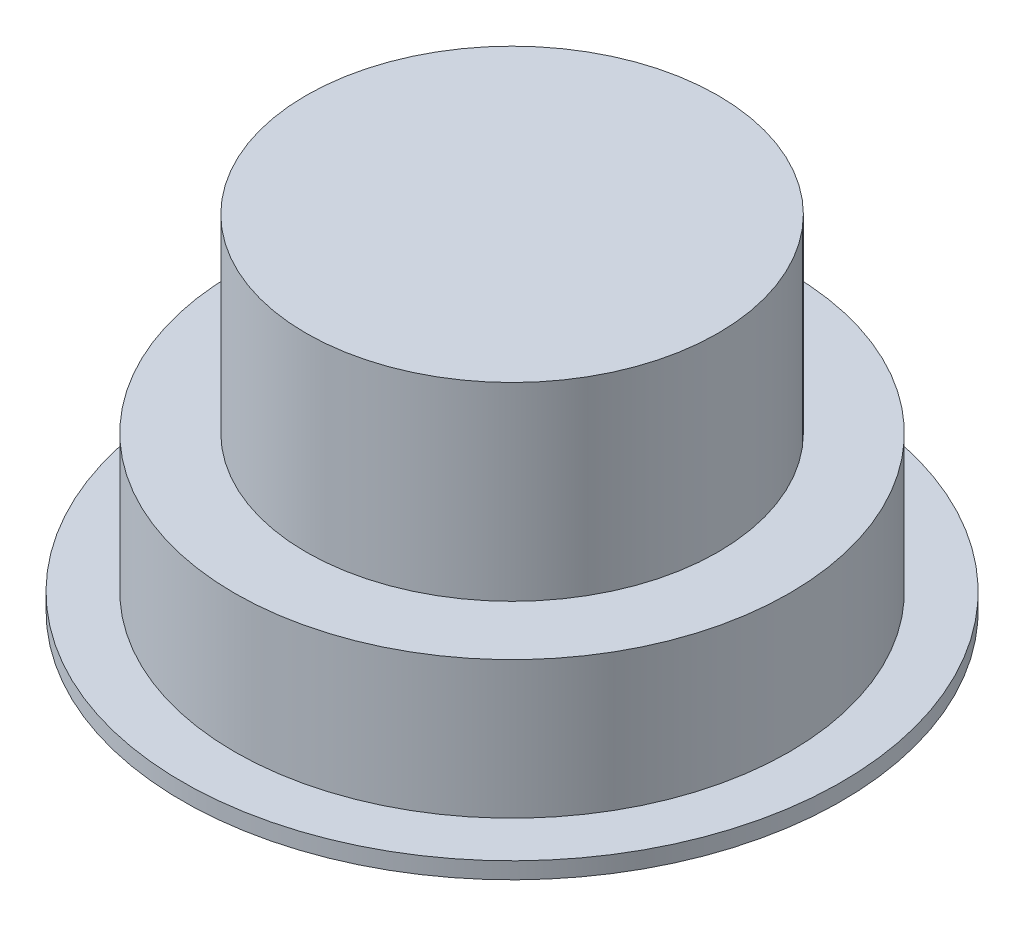
ISO-10303-21;
HEADER;
FILE_DESCRIPTION(('STEP AP214'),'2;1');
FILE_NAME('part.step','',(''),(''),'','','');
FILE_SCHEMA(('AUTOMOTIVE_DESIGN { 1 0 10303 214 1 1 1 1 }'));
ENDSEC;
DATA;
#1=APPLICATION_CONTEXT('core data for automotive mechanical design processes');
#2=APPLICATION_PROTOCOL_DEFINITION('international standard','automotive_design',2000,#1);
#3=PRODUCT_CONTEXT('',#1,'mechanical');
#4=PRODUCT('Part','Part','',(#3));
#5=PRODUCT_RELATED_PRODUCT_CATEGORY('part','',(#4));
#6=PRODUCT_DEFINITION_FORMATION('','',#4);
#7=PRODUCT_DEFINITION_CONTEXT('part definition',#1,'design');
#8=PRODUCT_DEFINITION('design','',#6,#7);
#9=PRODUCT_DEFINITION_SHAPE('','',#8);
#10=(LENGTH_UNIT() NAMED_UNIT(*) SI_UNIT(.MILLI.,.METRE.));
#11=(NAMED_UNIT(*) PLANE_ANGLE_UNIT() SI_UNIT($,.RADIAN.));
#12=(NAMED_UNIT(*) SI_UNIT($,.STERADIAN.) SOLID_ANGLE_UNIT());
#13=UNCERTAINTY_MEASURE_WITH_UNIT(LENGTH_MEASURE(1.E-05),#10,'distance_accuracy_value','');
#14=(GEOMETRIC_REPRESENTATION_CONTEXT(3) GLOBAL_UNCERTAINTY_ASSIGNED_CONTEXT((#13)) GLOBAL_UNIT_ASSIGNED_CONTEXT((#10,
#11,#12)) REPRESENTATION_CONTEXT('',''));
#15=CARTESIAN_POINT('',(0.,0.,0.));
#16=DIRECTION('',(0.,0.,1.));
#17=DIRECTION('',(1.,0.,0.));
#18=AXIS2_PLACEMENT_3D('',#15,#16,#17);
#19=CARTESIAN_POINT('',(0.,-2.,0.));
#20=DIRECTION('',(0.,-1.,0.));
#21=DIRECTION('',(0.,0.,-1.));
#22=AXIS2_PLACEMENT_3D('',#19,#20,#21);
#23=PLANE('',#22);
#24=CARTESIAN_POINT('',(0.,-2.,0.));
#25=DIRECTION('',(0.,-1.,0.));
#26=DIRECTION('',(0.,0.,-1.));
#27=AXIS2_PLACEMENT_3D('',#24,#25,#26);
#28=CIRCLE('',#27,8.50000000000005);
#29=CARTESIAN_POINT('',(0.,-2.,-8.50000000000005));
#30=VERTEX_POINT('',#29);
#31=EDGE_CURVE('E49',#30,#30,#28,.F.);
#32=ORIENTED_EDGE('',*,*,#31,.T.);
#33=EDGE_LOOP('',(#32));
#34=FACE_BOUND('',#33,.T.);
#35=CARTESIAN_POINT('',(0.,-2.,0.));
#36=DIRECTION('',(0.,-1.,0.));
#37=DIRECTION('',(0.,0.,-1.));
#38=AXIS2_PLACEMENT_3D('',#35,#36,#37);
#39=CIRCLE('',#38,12.);
#40=CARTESIAN_POINT('',(0.,-2.,-12.));
#41=VERTEX_POINT('',#40);
#42=EDGE_CURVE('E74',#41,#41,#39,.T.);
#43=ORIENTED_EDGE('',*,*,#42,.T.);
#44=EDGE_LOOP('',(#43));
#45=FACE_BOUND('',#44,.T.);
#46=ADVANCED_FACE('F38',(#34,#45),#23,.T.);
#47=CARTESIAN_POINT('',(0.,5.,0.));
#48=DIRECTION('',(0.,-1.,0.));
#49=DIRECTION('',(0.,0.,-1.));
#50=AXIS2_PLACEMENT_3D('',#47,#48,#49);
#51=PLANE('',#50);
#52=CARTESIAN_POINT('',(0.,5.,0.));
#53=DIRECTION('',(0.,-1.,0.));
#54=DIRECTION('',(0.,0.,-1.));
#55=AXIS2_PLACEMENT_3D('',#52,#53,#54);
#56=CIRCLE('',#55,5.00000000000002);
#57=CARTESIAN_POINT('',(0.,5.,-5.00000000000002));
#58=VERTEX_POINT('',#57);
#59=EDGE_CURVE('E45',#58,#58,#56,.T.);
#60=ORIENTED_EDGE('',*,*,#59,.T.);
#61=EDGE_LOOP('',(#60));
#62=FACE_BOUND('',#61,.T.);
#63=CARTESIAN_POINT('',(0.,5.,0.));
#64=DIRECTION('',(0.,-1.,0.));
#65=DIRECTION('',(0.,0.,-1.));
#66=AXIS2_PLACEMENT_3D('',#63,#64,#65);
#67=CIRCLE('',#66,2.9);
#68=CARTESIAN_POINT('',(0.,5.,-2.9));
#69=VERTEX_POINT('',#68);
#70=EDGE_CURVE('E65',#69,#69,#67,.T.);
#71=ORIENTED_EDGE('',*,*,#70,.F.);
#72=EDGE_LOOP('',(#71));
#73=FACE_BOUND('',#72,.T.);
#74=ADVANCED_FACE('F101',(#62,#73),#51,.T.);
#75=CARTESIAN_POINT('',(0.,-1.,0.));
#76=DIRECTION('',(0.,1.,0.));
#77=DIRECTION('',(0.,0.,1.));
#78=AXIS2_PLACEMENT_3D('',#75,#76,#77);
#79=CYLINDRICAL_SURFACE('',#78,2.9);
#80=CARTESIAN_POINT('',(0.,-1.,0.));
#81=DIRECTION('',(0.,-1.,0.));
#82=DIRECTION('',(0.,0.,-1.));
#83=AXIS2_PLACEMENT_3D('',#80,#81,#82);
#84=CIRCLE('',#83,2.9);
#85=CARTESIAN_POINT('',(0.,-1.,-2.9));
#86=VERTEX_POINT('',#85);
#87=EDGE_CURVE('E64',#86,#86,#84,.T.);
#88=ORIENTED_EDGE('',*,*,#87,.F.);
#89=EDGE_LOOP('',(#88));
#90=FACE_BOUND('',#89,.T.);
#91=ORIENTED_EDGE('',*,*,#70,.T.);
#92=EDGE_LOOP('',(#91));
#93=FACE_BOUND('',#92,.T.);
#94=ADVANCED_FACE('F107',(#90,#93),#79,.T.);
#95=CARTESIAN_POINT('',(0.,5.50000000000002,0.));
#96=DIRECTION('',(0.,-1.,0.));
#97=DIRECTION('',(0.,0.,-1.));
#98=AXIS2_PLACEMENT_3D('',#95,#96,#97);
#99=CONICAL_SURFACE('',#98,4.75,0.46364760900081);
#100=ORIENTED_EDGE('',*,*,#31,.F.);
#101=EDGE_LOOP('',(#100));
#102=FACE_BOUND('',#101,.T.);
#103=ORIENTED_EDGE('',*,*,#59,.F.);
#104=EDGE_LOOP('',(#103));
#105=FACE_BOUND('',#104,.T.);
#106=ADVANCED_FACE('F113',(#102,#105),#99,.F.);
#107=CARTESIAN_POINT('',(0.,6.5,0.));
#108=DIRECTION('',(0.,-1.,0.));
#109=DIRECTION('',(0.,0.,-1.));
#110=AXIS2_PLACEMENT_3D('',#107,#108,#109);
#111=CYLINDRICAL_SURFACE('',#110,1.25);
#112=CARTESIAN_POINT('',(0.,0.96913686675152,0.));
#113=DIRECTION('',(0.,-1.,0.));
#114=DIRECTION('',(0.,0.,-1.));
#115=AXIS2_PLACEMENT_3D('',#112,#113,#114);
#116=CIRCLE('',#115,1.25);
#117=CARTESIAN_POINT('',(0.,0.96913686675152,-1.25));
#118=VERTEX_POINT('',#117);
#119=EDGE_CURVE('E10',#118,#118,#116,.T.);
#120=ORIENTED_EDGE('',*,*,#119,.T.);
#121=EDGE_LOOP('',(#120));
#122=FACE_BOUND('',#121,.T.);
#123=CARTESIAN_POINT('',(0.,6.5,0.));
#124=DIRECTION('',(0.,-1.,0.));
#125=DIRECTION('',(0.,0.,-1.));
#126=AXIS2_PLACEMENT_3D('',#123,#124,#125);
#127=CIRCLE('',#126,1.25);
#128=CARTESIAN_POINT('',(0.,6.5,-1.25));
#129=VERTEX_POINT('',#128);
#130=EDGE_CURVE('E68',#129,#129,#127,.T.);
#131=ORIENTED_EDGE('',*,*,#130,.F.);
#132=EDGE_LOOP('',(#131));
#133=FACE_BOUND('',#132,.T.);
#134=ADVANCED_FACE('F115',(#122,#133),#111,.F.);
#135=CARTESIAN_POINT('',(0.,6.5,0.));
#136=DIRECTION('',(0.,-1.,0.));
#137=DIRECTION('',(0.,0.,-1.));
#138=AXIS2_PLACEMENT_3D('',#135,#136,#137);
#139=PLANE('',#138);
#140=ORIENTED_EDGE('',*,*,#130,.T.);
#141=EDGE_LOOP('',(#140));
#142=FACE_BOUND('',#141,.T.);
#143=ADVANCED_FACE('F118',(#142),#139,.T.);
#144=CARTESIAN_POINT('',(0.,-1.4,0.));
#145=DIRECTION('',(0.,-1.,0.));
#146=DIRECTION('',(0.,0.,-1.));
#147=AXIS2_PLACEMENT_3D('',#144,#145,#146);
#148=CYLINDRICAL_SURFACE('',#147,12.);
#149=CARTESIAN_POINT('',(0.,-1.4,0.));
#150=DIRECTION('',(0.,-1.,0.));
#151=DIRECTION('',(0.,0.,-1.));
#152=AXIS2_PLACEMENT_3D('',#149,#150,#151);
#153=CIRCLE('',#152,12.);
#154=CARTESIAN_POINT('',(0.,-1.4,-12.));
#155=VERTEX_POINT('',#154);
#156=EDGE_CURVE('E73',#155,#155,#153,.T.);
#157=ORIENTED_EDGE('',*,*,#156,.T.);
#158=EDGE_LOOP('',(#157));
#159=FACE_BOUND('',#158,.T.);
#160=ORIENTED_EDGE('',*,*,#42,.F.);
#161=EDGE_LOOP('',(#160));
#162=FACE_BOUND('',#161,.T.);
#163=ADVANCED_FACE('F121',(#159,#162),#148,.T.);
#164=CARTESIAN_POINT('',(0.,-1.4,0.));
#165=DIRECTION('',(0.,-1.,0.));
#166=DIRECTION('',(0.,0.,-1.));
#167=AXIS2_PLACEMENT_3D('',#164,#165,#166);
#168=PLANE('',#167);
#169=CARTESIAN_POINT('',(0.,-1.4,0.));
#170=DIRECTION('',(0.,-1.,0.));
#171=DIRECTION('',(0.,0.,-1.));
#172=AXIS2_PLACEMENT_3D('',#169,#170,#171);
#173=CIRCLE('',#172,10.1);
#174=CARTESIAN_POINT('',(0.,-1.4,-10.1));
#175=VERTEX_POINT('',#174);
#176=EDGE_CURVE('E77',#175,#175,#173,.T.);
#177=ORIENTED_EDGE('',*,*,#176,.T.);
#178=EDGE_LOOP('',(#177));
#179=FACE_BOUND('',#178,.T.);
#180=ORIENTED_EDGE('',*,*,#156,.F.);
#181=EDGE_LOOP('',(#180));
#182=FACE_BOUND('',#181,.T.);
#183=ADVANCED_FACE('F83',(#179,#182),#168,.F.);
#184=CARTESIAN_POINT('',(0.,10.5,0.));
#185=DIRECTION('',(0.,1.,0.));
#186=DIRECTION('',(0.,0.,1.));
#187=AXIS2_PLACEMENT_3D('',#184,#185,#186);
#188=PLANE('',#187);
#189=CARTESIAN_POINT('',(0.,10.5,0.));
#190=DIRECTION('',(0.,1.,0.));
#191=DIRECTION('',(0.,0.,1.));
#192=AXIS2_PLACEMENT_3D('',#189,#190,#191);
#193=CIRCLE('',#192,7.5);
#194=CARTESIAN_POINT('',(0.,10.5,-7.5));
#195=VERTEX_POINT('',#194);
#196=EDGE_CURVE('E58',#195,#195,#193,.T.);
#197=ORIENTED_EDGE('',*,*,#196,.T.);
#198=EDGE_LOOP('',(#197));
#199=FACE_BOUND('',#198,.T.);
#200=ADVANCED_FACE('F127',(#199),#188,.T.);
#201=CARTESIAN_POINT('',(0.,10.5,0.));
#202=DIRECTION('',(0.,-1.,0.));
#203=DIRECTION('',(0.,0.,-1.));
#204=AXIS2_PLACEMENT_3D('',#201,#202,#203);
#205=CYLINDRICAL_SURFACE('',#204,7.5);
#206=CARTESIAN_POINT('',(0.,3.6,0.));
#207=DIRECTION('',(0.,-1.,0.));
#208=DIRECTION('',(0.,0.,-1.));
#209=AXIS2_PLACEMENT_3D('',#206,#207,#208);
#210=CIRCLE('',#209,7.5);
#211=CARTESIAN_POINT('',(0.,3.6,-7.5));
#212=VERTEX_POINT('',#211);
#213=EDGE_CURVE('E53',#212,#212,#210,.T.);
#214=CARTESIAN_POINT('',(0.,10.5,-7.5));
#215=CARTESIAN_POINT('',(0.,10.428125,-7.5));
#216=CARTESIAN_POINT('',(0.,10.35625,-7.5));
#217=CARTESIAN_POINT('',(0.,10.2125,-7.5));
#218=CARTESIAN_POINT('',(0.,10.140625,-7.5));
#219=CARTESIAN_POINT('',(0.,9.996875,-7.5));
#220=CARTESIAN_POINT('',(0.,9.925,-7.5));
#221=CARTESIAN_POINT('',(0.,9.78125,-7.5));
#222=CARTESIAN_POINT('',(0.,9.709375,-7.5));
#223=CARTESIAN_POINT('',(0.,9.565625,-7.5));
#224=CARTESIAN_POINT('',(0.,9.49375,-7.5));
#225=CARTESIAN_POINT('',(0.,9.35,-7.5));
#226=CARTESIAN_POINT('',(0.,9.278125,-7.5));
#227=CARTESIAN_POINT('',(0.,9.134375,-7.5));
#228=CARTESIAN_POINT('',(0.,9.0625,-7.5));
#229=CARTESIAN_POINT('',(0.,8.91875,-7.5));
#230=CARTESIAN_POINT('',(0.,8.846875,-7.5));
#231=CARTESIAN_POINT('',(0.,8.703125,-7.5));
#232=CARTESIAN_POINT('',(0.,8.63125,-7.5));
#233=CARTESIAN_POINT('',(0.,8.4875,-7.5));
#234=CARTESIAN_POINT('',(0.,8.415625,-7.5));
#235=CARTESIAN_POINT('',(0.,8.271875,-7.5));
#236=CARTESIAN_POINT('',(0.,8.2,-7.5));
#237=CARTESIAN_POINT('',(0.,8.05625,-7.5));
#238=CARTESIAN_POINT('',(0.,7.984375,-7.5));
#239=CARTESIAN_POINT('',(0.,7.840625,-7.5));
#240=CARTESIAN_POINT('',(0.,7.76875,-7.5));
#241=CARTESIAN_POINT('',(0.,7.625,-7.5));
#242=CARTESIAN_POINT('',(0.,7.553125,-7.5));
#243=CARTESIAN_POINT('',(0.,7.409375,-7.5));
#244=CARTESIAN_POINT('',(0.,7.3375,-7.5));
#245=CARTESIAN_POINT('',(0.,7.19375,-7.5));
#246=CARTESIAN_POINT('',(0.,7.121875,-7.5));
#247=CARTESIAN_POINT('',(0.,6.978125,-7.5));
#248=CARTESIAN_POINT('',(0.,6.90625,-7.5));
#249=CARTESIAN_POINT('',(0.,6.7625,-7.5));
#250=CARTESIAN_POINT('',(0.,6.690625,-7.5));
#251=CARTESIAN_POINT('',(0.,6.546875,-7.5));
#252=CARTESIAN_POINT('',(0.,6.475,-7.5));
#253=CARTESIAN_POINT('',(0.,6.33125,-7.5));
#254=CARTESIAN_POINT('',(0.,6.259375,-7.5));
#255=CARTESIAN_POINT('',(0.,6.115625,-7.5));
#256=CARTESIAN_POINT('',(0.,6.04375,-7.5));
#257=CARTESIAN_POINT('',(0.,5.9,-7.5));
#258=CARTESIAN_POINT('',(0.,5.828125,-7.5));
#259=CARTESIAN_POINT('',(0.,5.684375,-7.5));
#260=CARTESIAN_POINT('',(0.,5.6125,-7.5));
#261=CARTESIAN_POINT('',(0.,5.46875,-7.5));
#262=CARTESIAN_POINT('',(0.,5.396875,-7.5));
#263=CARTESIAN_POINT('',(0.,5.253125,-7.5));
#264=CARTESIAN_POINT('',(0.,5.18125,-7.5));
#265=CARTESIAN_POINT('',(0.,5.0375,-7.5));
#266=CARTESIAN_POINT('',(0.,4.965625,-7.5));
#267=CARTESIAN_POINT('',(0.,4.821875,-7.5));
#268=CARTESIAN_POINT('',(0.,4.75,-7.5));
#269=CARTESIAN_POINT('',(0.,4.60625,-7.5));
#270=CARTESIAN_POINT('',(0.,4.534375,-7.5));
#271=CARTESIAN_POINT('',(0.,4.390625,-7.5));
#272=CARTESIAN_POINT('',(0.,4.31875,-7.5));
#273=CARTESIAN_POINT('',(0.,4.175,-7.5));
#274=CARTESIAN_POINT('',(0.,4.103125,-7.5));
#275=CARTESIAN_POINT('',(0.,3.959375,-7.5));
#276=CARTESIAN_POINT('',(0.,3.8875,-7.5));
#277=CARTESIAN_POINT('',(0.,3.74375,-7.5));
#278=CARTESIAN_POINT('',(0.,3.671875,-7.5));
#279=CARTESIAN_POINT('',(0.,3.6,-7.5));
#280=B_SPLINE_CURVE_WITH_KNOTS('',3,(#214,#215,#216,#217,#218,#219,#220,#221,#222,#223,#224,
#225,#226,#227,#228,#229,#230,#231,#232,#233,#234,#235,#236,#237,#238,#239,#240,#241,#242,#243,
#244,#245,#246,#247,#248,#249,#250,#251,#252,#253,#254,#255,#256,#257,#258,#259,#260,#261,#262,
#263,#264,#265,#266,#267,#268,#269,#270,#271,#272,#273,#274,#275,#276,#277,#278,#279),
.UNSPECIFIED.,.F.,.F.,(4,2,2,2,2,2,2,2,2,2,2,2,2,2,2,2,2,2,2,2,2,2,2,2,2,2,2,2,2,2,2,2,4),(0.,
0.215625000000001,0.431250000000001,0.646875000000002,0.8625,1.078125,1.29375,1.509375,1.725,
1.940625,2.15625,2.371875,2.5875,2.803125,3.01875,3.234375,3.45,3.665625,3.88125,4.096875,
4.3125,4.528125,4.74375,4.959375,5.175,5.390625,5.60625,5.821875,6.0375,6.253125,6.46875,
6.684375,6.9),.UNSPECIFIED.);
#281=EDGE_CURVE('BSEAM96',#195,#212,#280,.T.);
#282=ORIENTED_EDGE('',*,*,#196,.F.);
#283=ORIENTED_EDGE('',*,*,#213,.F.);
#284=ORIENTED_EDGE('',*,*,#281,.T.);
#285=ORIENTED_EDGE('',*,*,#281,.F.);
#286=EDGE_LOOP('',(#282,#284,#283,#285));
#287=FACE_BOUND('',#286,.T.);
#288=ADVANCED_FACE('F96',(#287),#205,.T.);
#289=CARTESIAN_POINT('',(0.,3.6,0.));
#290=DIRECTION('',(0.,-1.,0.));
#291=DIRECTION('',(0.,0.,-1.));
#292=AXIS2_PLACEMENT_3D('',#289,#290,#291);
#293=PLANE('',#292);
#294=ORIENTED_EDGE('',*,*,#213,.T.);
#295=EDGE_LOOP('',(#294));
#296=FACE_BOUND('',#295,.T.);
#297=CARTESIAN_POINT('',(0.,3.6,0.));
#298=DIRECTION('',(0.,-1.,0.));
#299=DIRECTION('',(0.,0.,-1.));
#300=AXIS2_PLACEMENT_3D('',#297,#298,#299);
#301=CIRCLE('',#300,10.1);
#302=CARTESIAN_POINT('',(0.,3.6,-10.1));
#303=VERTEX_POINT('',#302);
#304=EDGE_CURVE('E61',#303,#303,#301,.T.);
#305=ORIENTED_EDGE('',*,*,#304,.F.);
#306=EDGE_LOOP('',(#305));
#307=FACE_BOUND('',#306,.T.);
#308=ADVANCED_FACE('F88',(#296,#307),#293,.F.);
#309=CARTESIAN_POINT('',(0.,3.6,0.));
#310=DIRECTION('',(0.,-1.,0.));
#311=DIRECTION('',(0.,0.,-1.));
#312=AXIS2_PLACEMENT_3D('',#309,#310,#311);
#313=CYLINDRICAL_SURFACE('',#312,10.1);
#314=ORIENTED_EDGE('',*,*,#304,.T.);
#315=EDGE_LOOP('',(#314));
#316=FACE_BOUND('',#315,.T.);
#317=ORIENTED_EDGE('',*,*,#176,.F.);
#318=EDGE_LOOP('',(#317));
#319=FACE_BOUND('',#318,.T.);
#320=ADVANCED_FACE('F86',(#316,#319),#313,.T.);
#321=CARTESIAN_POINT('',(0.,0.969136866751521,0.));
#322=DIRECTION('',(0.,-1.,0.));
#323=DIRECTION('',(0.,0.,-1.));
#324=AXIS2_PLACEMENT_3D('',#321,#322,#323);
#325=TOROIDAL_SURFACE('',#324,3.25,2.);
#326=ORIENTED_EDGE('',*,*,#87,.T.);
#327=EDGE_LOOP('',(#326));
#328=FACE_BOUND('',#327,.T.);
#329=ORIENTED_EDGE('',*,*,#119,.F.);
#330=EDGE_LOOP('',(#329));
#331=FACE_BOUND('',#330,.T.);
#332=ADVANCED_FACE('F40',(#328,#331),#325,.T.);
#333=CLOSED_SHELL('',(#46,#74,#94,#106,#134,#143,#163,#183,#200,#288,#308,#320,#332));
#334=MANIFOLD_SOLID_BREP('B2',#333);
#335=ADVANCED_BREP_SHAPE_REPRESENTATION('',(#18,#334),#14);
#336=SHAPE_DEFINITION_REPRESENTATION(#9,#335);
ENDSEC;
END-ISO-10303-21;
